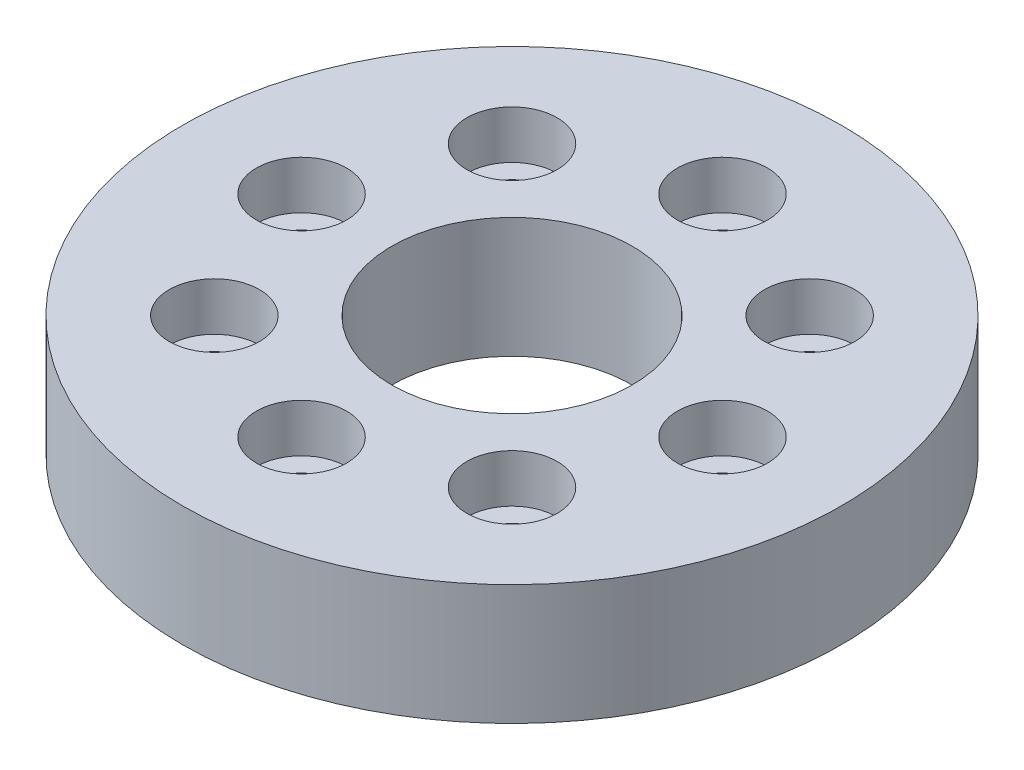
ISO-10303-21;
HEADER;
FILE_DESCRIPTION(('STEP AP214'),'2;1');
FILE_NAME('part.step','',(''),(''),'','','');
FILE_SCHEMA(('AUTOMOTIVE_DESIGN { 1 0 10303 214 1 1 1 1 }'));
ENDSEC;
DATA;
#1=APPLICATION_CONTEXT('core data for automotive mechanical design processes');
#2=APPLICATION_PROTOCOL_DEFINITION('international standard','automotive_design',2000,#1);
#3=PRODUCT_CONTEXT('',#1,'mechanical');
#4=PRODUCT('Part','Part','',(#3));
#5=PRODUCT_RELATED_PRODUCT_CATEGORY('part','',(#4));
#6=PRODUCT_DEFINITION_FORMATION('','',#4);
#7=PRODUCT_DEFINITION_CONTEXT('part definition',#1,'design');
#8=PRODUCT_DEFINITION('design','',#6,#7);
#9=PRODUCT_DEFINITION_SHAPE('','',#8);
#10=(LENGTH_UNIT() NAMED_UNIT(*) SI_UNIT(.MILLI.,.METRE.));
#11=(NAMED_UNIT(*) PLANE_ANGLE_UNIT() SI_UNIT($,.RADIAN.));
#12=(NAMED_UNIT(*) SI_UNIT($,.STERADIAN.) SOLID_ANGLE_UNIT());
#13=UNCERTAINTY_MEASURE_WITH_UNIT(LENGTH_MEASURE(1.E-05),#10,'distance_accuracy_value','');
#14=(GEOMETRIC_REPRESENTATION_CONTEXT(3) GLOBAL_UNCERTAINTY_ASSIGNED_CONTEXT((#13)) GLOBAL_UNIT_ASSIGNED_CONTEXT((#10,
#11,#12)) REPRESENTATION_CONTEXT('',''));
#15=CARTESIAN_POINT('',(0.,0.,0.));
#16=DIRECTION('',(0.,0.,1.));
#17=DIRECTION('',(1.,0.,0.));
#18=AXIS2_PLACEMENT_3D('',#15,#16,#17);
#19=CARTESIAN_POINT('',(12.3743686707646,10.,-12.3743686707646));
#20=DIRECTION('',(0.,-1.,0.));
#21=DIRECTION('',(0.,0.,-1.));
#22=AXIS2_PLACEMENT_3D('',#19,#20,#21);
#23=CYLINDRICAL_SURFACE('',#22,2.);
#24=CARTESIAN_POINT('',(12.3743686707646,0.,-12.3743686707646));
#25=DIRECTION('',(0.,1.,0.));
#26=DIRECTION('',(0.,0.,1.));
#27=AXIS2_PLACEMENT_3D('',#24,#25,#26);
#28=CIRCLE('',#27,2.);
#29=CARTESIAN_POINT('',(12.3743686707646,0.,-10.3743686707646));
#30=VERTEX_POINT('',#29);
#31=EDGE_CURVE('E80',#30,#30,#28,.T.);
#32=ORIENTED_EDGE('',*,*,#31,.F.);
#33=EDGE_LOOP('',(#32));
#34=FACE_BOUND('',#33,.T.);
#35=CARTESIAN_POINT('',(12.3743686707646,6.,-12.3743686707646));
#36=DIRECTION('',(0.,1.,0.));
#37=DIRECTION('',(0.,0.,1.));
#38=AXIS2_PLACEMENT_3D('',#35,#36,#37);
#39=CIRCLE('',#38,2.);
#40=CARTESIAN_POINT('',(12.3743686707646,6.,-10.3743686707646));
#41=VERTEX_POINT('',#40);
#42=EDGE_CURVE('E43',#41,#41,#39,.T.);
#43=ORIENTED_EDGE('',*,*,#42,.T.);
#44=EDGE_LOOP('',(#43));
#45=FACE_BOUND('',#44,.T.);
#46=ADVANCED_FACE('F39',(#34,#45),#23,.F.);
#47=CARTESIAN_POINT('',(17.5,10.,0.));
#48=DIRECTION('',(0.,-1.,0.));
#49=DIRECTION('',(0.,0.,-1.));
#50=AXIS2_PLACEMENT_3D('',#47,#48,#49);
#51=CYLINDRICAL_SURFACE('',#50,2.);
#52=CARTESIAN_POINT('',(17.5,0.,0.));
#53=DIRECTION('',(0.,1.,0.));
#54=DIRECTION('',(0.,0.,1.));
#55=AXIS2_PLACEMENT_3D('',#52,#53,#54);
#56=CIRCLE('',#55,2.);
#57=CARTESIAN_POINT('',(17.5,0.,2.00000000000006));
#58=VERTEX_POINT('',#57);
#59=EDGE_CURVE('E77',#58,#58,#56,.T.);
#60=ORIENTED_EDGE('',*,*,#59,.F.);
#61=EDGE_LOOP('',(#60));
#62=FACE_BOUND('',#61,.T.);
#63=CARTESIAN_POINT('',(17.5,6.,0.));
#64=DIRECTION('',(0.,1.,0.));
#65=DIRECTION('',(0.,0.,1.));
#66=AXIS2_PLACEMENT_3D('',#63,#64,#65);
#67=CIRCLE('',#66,2.);
#68=CARTESIAN_POINT('',(17.5,6.,2.00000000000006));
#69=VERTEX_POINT('',#68);
#70=EDGE_CURVE('E103',#69,#69,#67,.T.);
#71=ORIENTED_EDGE('',*,*,#70,.T.);
#72=EDGE_LOOP('',(#71));
#73=FACE_BOUND('',#72,.T.);
#74=ADVANCED_FACE('F221',(#62,#73),#51,.F.);
#75=CARTESIAN_POINT('',(12.3743686707645,10.,12.3743686707646));
#76=DIRECTION('',(0.,-1.,0.));
#77=DIRECTION('',(0.,0.,-1.));
#78=AXIS2_PLACEMENT_3D('',#75,#76,#77);
#79=CYLINDRICAL_SURFACE('',#78,2.);
#80=CARTESIAN_POINT('',(12.3743686707645,0.,12.3743686707646));
#81=DIRECTION('',(0.,1.,0.));
#82=DIRECTION('',(0.,0.,1.));
#83=AXIS2_PLACEMENT_3D('',#80,#81,#82);
#84=CIRCLE('',#83,2.);
#85=CARTESIAN_POINT('',(12.3743686707645,0.,14.3743686707646));
#86=VERTEX_POINT('',#85);
#87=EDGE_CURVE('E74',#86,#86,#84,.T.);
#88=ORIENTED_EDGE('',*,*,#87,.F.);
#89=EDGE_LOOP('',(#88));
#90=FACE_BOUND('',#89,.T.);
#91=CARTESIAN_POINT('',(12.3743686707645,6.,12.3743686707646));
#92=DIRECTION('',(0.,1.,0.));
#93=DIRECTION('',(0.,0.,1.));
#94=AXIS2_PLACEMENT_3D('',#91,#92,#93);
#95=CIRCLE('',#94,2.);
#96=CARTESIAN_POINT('',(12.3743686707645,6.,14.3743686707646));
#97=VERTEX_POINT('',#96);
#98=EDGE_CURVE('E101',#97,#97,#95,.T.);
#99=ORIENTED_EDGE('',*,*,#98,.T.);
#100=EDGE_LOOP('',(#99));
#101=FACE_BOUND('',#100,.T.);
#102=ADVANCED_FACE('F226',(#90,#101),#79,.F.);
#103=CARTESIAN_POINT('',(-1.2220184685951E-13,10.,17.5));
#104=DIRECTION('',(0.,-1.,0.));
#105=DIRECTION('',(0.,0.,-1.));
#106=AXIS2_PLACEMENT_3D('',#103,#104,#105);
#107=CYLINDRICAL_SURFACE('',#106,2.);
#108=CARTESIAN_POINT('',(-1.2220184685951E-13,0.,17.5));
#109=DIRECTION('',(0.,1.,0.));
#110=DIRECTION('',(0.,0.,1.));
#111=AXIS2_PLACEMENT_3D('',#108,#109,#110);
#112=CIRCLE('',#111,2.);
#113=CARTESIAN_POINT('',(-1.2220184685951E-13,0.,19.5));
#114=VERTEX_POINT('',#113);
#115=EDGE_CURVE('E71',#114,#114,#112,.T.);
#116=ORIENTED_EDGE('',*,*,#115,.F.);
#117=EDGE_LOOP('',(#116));
#118=FACE_BOUND('',#117,.T.);
#119=CARTESIAN_POINT('',(-1.2220184685951E-13,6.,17.5));
#120=DIRECTION('',(0.,1.,0.));
#121=DIRECTION('',(0.,0.,1.));
#122=AXIS2_PLACEMENT_3D('',#119,#120,#121);
#123=CIRCLE('',#122,2.);
#124=CARTESIAN_POINT('',(-1.2220184685951E-13,6.,19.5));
#125=VERTEX_POINT('',#124);
#126=EDGE_CURVE('E98',#125,#125,#123,.T.);
#127=ORIENTED_EDGE('',*,*,#126,.T.);
#128=EDGE_LOOP('',(#127));
#129=FACE_BOUND('',#128,.T.);
#130=ADVANCED_FACE('F232',(#118,#129),#107,.F.);
#131=CARTESIAN_POINT('',(-12.3743686707647,10.,12.3743686707645));
#132=DIRECTION('',(0.,-1.,0.));
#133=DIRECTION('',(0.,0.,-1.));
#134=AXIS2_PLACEMENT_3D('',#131,#132,#133);
#135=CYLINDRICAL_SURFACE('',#134,2.);
#136=CARTESIAN_POINT('',(-12.3743686707647,0.,12.3743686707645));
#137=DIRECTION('',(0.,1.,0.));
#138=DIRECTION('',(0.,0.,1.));
#139=AXIS2_PLACEMENT_3D('',#136,#137,#138);
#140=CIRCLE('',#139,2.);
#141=CARTESIAN_POINT('',(-12.3743686707647,0.,14.3743686707645));
#142=VERTEX_POINT('',#141);
#143=EDGE_CURVE('E68',#142,#142,#140,.T.);
#144=ORIENTED_EDGE('',*,*,#143,.F.);
#145=EDGE_LOOP('',(#144));
#146=FACE_BOUND('',#145,.T.);
#147=CARTESIAN_POINT('',(-12.3743686707647,6.,12.3743686707645));
#148=DIRECTION('',(0.,1.,0.));
#149=DIRECTION('',(0.,0.,1.));
#150=AXIS2_PLACEMENT_3D('',#147,#148,#149);
#151=CIRCLE('',#150,2.);
#152=CARTESIAN_POINT('',(-12.3743686707647,6.,14.3743686707645));
#153=VERTEX_POINT('',#152);
#154=EDGE_CURVE('E95',#153,#153,#151,.T.);
#155=ORIENTED_EDGE('',*,*,#154,.T.);
#156=EDGE_LOOP('',(#155));
#157=FACE_BOUND('',#156,.T.);
#158=ADVANCED_FACE('F236',(#146,#157),#135,.F.);
#159=CARTESIAN_POINT('',(-17.5,10.,-1.83302770289265E-13));
#160=DIRECTION('',(0.,-1.,0.));
#161=DIRECTION('',(0.,0.,-1.));
#162=AXIS2_PLACEMENT_3D('',#159,#160,#161);
#163=CYLINDRICAL_SURFACE('',#162,2.);
#164=CARTESIAN_POINT('',(-17.5,0.,-1.83302770289265E-13));
#165=DIRECTION('',(0.,1.,0.));
#166=DIRECTION('',(0.,0.,1.));
#167=AXIS2_PLACEMENT_3D('',#164,#165,#166);
#168=CIRCLE('',#167,2.);
#169=CARTESIAN_POINT('',(-17.5,0.,1.99999999999982));
#170=VERTEX_POINT('',#169);
#171=EDGE_CURVE('E65',#170,#170,#168,.T.);
#172=ORIENTED_EDGE('',*,*,#171,.F.);
#173=EDGE_LOOP('',(#172));
#174=FACE_BOUND('',#173,.T.);
#175=CARTESIAN_POINT('',(-17.5,6.,-1.83302770289265E-13));
#176=DIRECTION('',(0.,1.,0.));
#177=DIRECTION('',(0.,0.,1.));
#178=AXIS2_PLACEMENT_3D('',#175,#176,#177);
#179=CIRCLE('',#178,2.);
#180=CARTESIAN_POINT('',(-17.5,6.,1.99999999999982));
#181=VERTEX_POINT('',#180);
#182=EDGE_CURVE('E92',#181,#181,#179,.T.);
#183=ORIENTED_EDGE('',*,*,#182,.T.);
#184=EDGE_LOOP('',(#183));
#185=FACE_BOUND('',#184,.T.);
#186=ADVANCED_FACE('F240',(#174,#185),#163,.F.);
#187=CARTESIAN_POINT('',(-12.3743686707644,10.,-12.3743686707647));
#188=DIRECTION('',(0.,-1.,0.));
#189=DIRECTION('',(0.,0.,-1.));
#190=AXIS2_PLACEMENT_3D('',#187,#188,#189);
#191=CYLINDRICAL_SURFACE('',#190,2.);
#192=CARTESIAN_POINT('',(-12.3743686707644,0.,-12.3743686707647));
#193=DIRECTION('',(0.,1.,0.));
#194=DIRECTION('',(0.,0.,1.));
#195=AXIS2_PLACEMENT_3D('',#192,#193,#194);
#196=CIRCLE('',#195,2.);
#197=CARTESIAN_POINT('',(-12.3743686707644,0.,-10.3743686707647));
#198=VERTEX_POINT('',#197);
#199=EDGE_CURVE('E62',#198,#198,#196,.T.);
#200=ORIENTED_EDGE('',*,*,#199,.F.);
#201=EDGE_LOOP('',(#200));
#202=FACE_BOUND('',#201,.T.);
#203=CARTESIAN_POINT('',(-12.3743686707644,6.,-12.3743686707647));
#204=DIRECTION('',(0.,1.,0.));
#205=DIRECTION('',(0.,0.,1.));
#206=AXIS2_PLACEMENT_3D('',#203,#204,#205);
#207=CIRCLE('',#206,2.);
#208=CARTESIAN_POINT('',(-12.3743686707644,6.,-10.3743686707647));
#209=VERTEX_POINT('',#208);
#210=EDGE_CURVE('E88',#209,#209,#207,.T.);
#211=ORIENTED_EDGE('',*,*,#210,.T.);
#212=EDGE_LOOP('',(#211));
#213=FACE_BOUND('',#212,.T.);
#214=ADVANCED_FACE('F244',(#202,#213),#191,.F.);
#215=CARTESIAN_POINT('',(0.,10.,-17.5));
#216=DIRECTION('',(0.,-1.,0.));
#217=DIRECTION('',(0.,0.,-1.));
#218=AXIS2_PLACEMENT_3D('',#215,#216,#217);
#219=CYLINDRICAL_SURFACE('',#218,2.);
#220=CARTESIAN_POINT('',(0.,0.,-17.5));
#221=DIRECTION('',(0.,1.,0.));
#222=DIRECTION('',(0.,0.,1.));
#223=AXIS2_PLACEMENT_3D('',#220,#221,#222);
#224=CIRCLE('',#223,2.);
#225=CARTESIAN_POINT('',(0.,0.,-15.5));
#226=VERTEX_POINT('',#225);
#227=EDGE_CURVE('E59',#226,#226,#224,.T.);
#228=ORIENTED_EDGE('',*,*,#227,.F.);
#229=EDGE_LOOP('',(#228));
#230=FACE_BOUND('',#229,.T.);
#231=CARTESIAN_POINT('',(0.,6.,-17.5));
#232=DIRECTION('',(0.,1.,0.));
#233=DIRECTION('',(0.,0.,1.));
#234=AXIS2_PLACEMENT_3D('',#231,#232,#233);
#235=CIRCLE('',#234,2.);
#236=CARTESIAN_POINT('',(0.,6.,-15.5));
#237=VERTEX_POINT('',#236);
#238=EDGE_CURVE('E85',#237,#237,#235,.T.);
#239=ORIENTED_EDGE('',*,*,#238,.T.);
#240=EDGE_LOOP('',(#239));
#241=FACE_BOUND('',#240,.T.);
#242=ADVANCED_FACE('F190',(#230,#241),#219,.F.);
#243=CARTESIAN_POINT('',(0.,10.,0.));
#244=DIRECTION('',(0.,-1.,0.));
#245=DIRECTION('',(0.,0.,-1.));
#246=AXIS2_PLACEMENT_3D('',#243,#244,#245);
#247=CYLINDRICAL_SURFACE('',#246,27.4);
#248=CARTESIAN_POINT('',(0.,10.,0.));
#249=DIRECTION('',(0.,1.,0.));
#250=DIRECTION('',(0.,0.,1.));
#251=AXIS2_PLACEMENT_3D('',#248,#249,#250);
#252=CIRCLE('',#251,27.4);
#253=CARTESIAN_POINT('',(0.,10.,27.4));
#254=VERTEX_POINT('',#253);
#255=EDGE_CURVE('E47',#254,#254,#252,.T.);
#256=ORIENTED_EDGE('',*,*,#255,.F.);
#257=EDGE_LOOP('',(#256));
#258=FACE_BOUND('',#257,.T.);
#259=CARTESIAN_POINT('',(0.,0.,0.));
#260=DIRECTION('',(0.,1.,0.));
#261=DIRECTION('',(0.,0.,1.));
#262=AXIS2_PLACEMENT_3D('',#259,#260,#261);
#263=CIRCLE('',#262,27.4);
#264=CARTESIAN_POINT('',(0.,0.,27.4));
#265=VERTEX_POINT('',#264);
#266=EDGE_CURVE('E56',#265,#265,#263,.T.);
#267=ORIENTED_EDGE('',*,*,#266,.T.);
#268=EDGE_LOOP('',(#267));
#269=FACE_BOUND('',#268,.T.);
#270=ADVANCED_FACE('F41',(#258,#269),#247,.T.);
#271=CARTESIAN_POINT('',(0.,10.,0.));
#272=DIRECTION('',(0.,-1.,0.));
#273=DIRECTION('',(0.,0.,-1.));
#274=AXIS2_PLACEMENT_3D('',#271,#272,#273);
#275=CYLINDRICAL_SURFACE('',#274,10.);
#276=CARTESIAN_POINT('',(0.,10.,0.));
#277=DIRECTION('',(0.,1.,0.));
#278=DIRECTION('',(0.,0.,1.));
#279=AXIS2_PLACEMENT_3D('',#276,#277,#278);
#280=CIRCLE('',#279,10.);
#281=CARTESIAN_POINT('',(0.,10.,10.));
#282=VERTEX_POINT('',#281);
#283=EDGE_CURVE('E10',#282,#282,#280,.T.);
#284=ORIENTED_EDGE('',*,*,#283,.T.);
#285=EDGE_LOOP('',(#284));
#286=FACE_BOUND('',#285,.T.);
#287=CARTESIAN_POINT('',(0.,0.,0.));
#288=DIRECTION('',(0.,1.,0.));
#289=DIRECTION('',(0.,0.,1.));
#290=AXIS2_PLACEMENT_3D('',#287,#288,#289);
#291=CIRCLE('',#290,10.);
#292=CARTESIAN_POINT('',(0.,0.,10.));
#293=VERTEX_POINT('',#292);
#294=EDGE_CURVE('E52',#293,#293,#291,.T.);
#295=ORIENTED_EDGE('',*,*,#294,.F.);
#296=EDGE_LOOP('',(#295));
#297=FACE_BOUND('',#296,.T.);
#298=ADVANCED_FACE('F177',(#286,#297),#275,.F.);
#299=CARTESIAN_POINT('',(0.,10.,0.));
#300=DIRECTION('',(0.,1.,0.));
#301=DIRECTION('',(0.,0.,1.));
#302=AXIS2_PLACEMENT_3D('',#299,#300,#301);
#303=PLANE('',#302);
#304=CARTESIAN_POINT('',(2.4459601011273E-13,10.,-17.5));
#305=DIRECTION('',(0.,1.,0.));
#306=DIRECTION('',(0.,0.,1.));
#307=AXIS2_PLACEMENT_3D('',#304,#305,#306);
#308=CIRCLE('',#307,3.75);
#309=CARTESIAN_POINT('',(2.4459601011273E-13,10.,-13.75));
#310=VERTEX_POINT('',#309);
#311=EDGE_CURVE('E144',#310,#310,#308,.T.);
#312=ORIENTED_EDGE('',*,*,#311,.F.);
#313=EDGE_LOOP('',(#312));
#314=FACE_BOUND('',#313,.T.);
#315=CARTESIAN_POINT('',(12.3743686707648,10.,-12.3743686707644));
#316=DIRECTION('',(0.,1.,0.));
#317=DIRECTION('',(0.,0.,1.));
#318=AXIS2_PLACEMENT_3D('',#315,#316,#317);
#319=CIRCLE('',#318,3.75);
#320=CARTESIAN_POINT('',(12.3743686707648,10.,-8.62436867076439));
#321=VERTEX_POINT('',#320);
#322=EDGE_CURVE('E121',#321,#321,#319,.T.);
#323=ORIENTED_EDGE('',*,*,#322,.F.);
#324=EDGE_LOOP('',(#323));
#325=FACE_BOUND('',#324,.T.);
#326=CARTESIAN_POINT('',(17.5,10.,3.08780778723872E-13));
#327=DIRECTION('',(0.,1.,0.));
#328=DIRECTION('',(0.,0.,1.));
#329=AXIS2_PLACEMENT_3D('',#326,#327,#328);
#330=CIRCLE('',#329,3.75);
#331=CARTESIAN_POINT('',(17.5,10.,3.75000000000031));
#332=VERTEX_POINT('',#331);
#333=EDGE_CURVE('E122',#332,#332,#330,.T.);
#334=ORIENTED_EDGE('',*,*,#333,.F.);
#335=EDGE_LOOP('',(#334));
#336=FACE_BOUND('',#335,.T.);
#337=CARTESIAN_POINT('',(12.3743686707643,10.,12.3743686707648));
#338=DIRECTION('',(0.,1.,0.));
#339=DIRECTION('',(0.,0.,1.));
#340=AXIS2_PLACEMENT_3D('',#337,#338,#339);
#341=CIRCLE('',#340,3.75);
#342=CARTESIAN_POINT('',(12.3743686707643,10.,16.1243686707648));
#343=VERTEX_POINT('',#342);
#344=EDGE_CURVE('E134',#343,#343,#341,.T.);
#345=ORIENTED_EDGE('',*,*,#344,.F.);
#346=EDGE_LOOP('',(#345));
#347=FACE_BOUND('',#346,.T.);
#348=CARTESIAN_POINT('',(-3.64291929955129E-13,10.,17.5));
#349=DIRECTION('',(0.,1.,0.));
#350=DIRECTION('',(0.,0.,1.));
#351=AXIS2_PLACEMENT_3D('',#348,#349,#350);
#352=CIRCLE('',#351,3.75);
#353=CARTESIAN_POINT('',(-3.64291929955129E-13,10.,21.25));
#354=VERTEX_POINT('',#353);
#355=EDGE_CURVE('E140',#354,#354,#352,.T.);
#356=ORIENTED_EDGE('',*,*,#355,.F.);
#357=EDGE_LOOP('',(#356));
#358=FACE_BOUND('',#357,.T.);
#359=CARTESIAN_POINT('',(-12.3743686707649,10.,12.3743686707643));
#360=DIRECTION('',(0.,1.,0.));
#361=DIRECTION('',(0.,0.,1.));
#362=AXIS2_PLACEMENT_3D('',#359,#360,#361);
#363=CIRCLE('',#362,3.75);
#364=CARTESIAN_POINT('',(-12.3743686707649,10.,16.1243686707643));
#365=VERTEX_POINT('',#364);
#366=EDGE_CURVE('E162',#365,#365,#363,.T.);
#367=ORIENTED_EDGE('',*,*,#366,.F.);
#368=EDGE_LOOP('',(#367));
#369=FACE_BOUND('',#368,.T.);
#370=CARTESIAN_POINT('',(-17.5,10.,-4.26741975090295E-13));
#371=DIRECTION('',(0.,1.,0.));
#372=DIRECTION('',(0.,0.,1.));
#373=AXIS2_PLACEMENT_3D('',#370,#371,#372);
#374=CIRCLE('',#373,3.75);
#375=CARTESIAN_POINT('',(-17.5,10.,3.74999999999957));
#376=VERTEX_POINT('',#375);
#377=EDGE_CURVE('E156',#376,#376,#374,.T.);
#378=ORIENTED_EDGE('',*,*,#377,.F.);
#379=EDGE_LOOP('',(#378));
#380=FACE_BOUND('',#379,.T.);
#381=CARTESIAN_POINT('',(-12.3743686707644,10.,-12.3743686707647));
#382=DIRECTION('',(0.,1.,0.));
#383=DIRECTION('',(0.,0.,1.));
#384=AXIS2_PLACEMENT_3D('',#381,#382,#383);
#385=CIRCLE('',#384,3.75);
#386=CARTESIAN_POINT('',(-12.3743686707644,10.,-8.62436867076473));
#387=VERTEX_POINT('',#386);
#388=EDGE_CURVE('E142',#387,#387,#385,.T.);
#389=ORIENTED_EDGE('',*,*,#388,.F.);
#390=EDGE_LOOP('',(#389));
#391=FACE_BOUND('',#390,.T.);
#392=ORIENTED_EDGE('',*,*,#255,.T.);
#393=EDGE_LOOP('',(#392));
#394=FACE_BOUND('',#393,.T.);
#395=ORIENTED_EDGE('',*,*,#283,.F.);
#396=EDGE_LOOP('',(#395));
#397=FACE_BOUND('',#396,.T.);
#398=ADVANCED_FACE('F173',(#314,#325,#336,#347,#358,#369,#380,#391,#394,#397),#303,.T.);
#399=CARTESIAN_POINT('',(0.,0.,0.));
#400=DIRECTION('',(0.,1.,0.));
#401=DIRECTION('',(0.,0.,1.));
#402=AXIS2_PLACEMENT_3D('',#399,#400,#401);
#403=PLANE('',#402);
#404=ORIENTED_EDGE('',*,*,#266,.F.);
#405=EDGE_LOOP('',(#404));
#406=FACE_BOUND('',#405,.T.);
#407=ORIENTED_EDGE('',*,*,#227,.T.);
#408=EDGE_LOOP('',(#407));
#409=FACE_BOUND('',#408,.T.);
#410=ORIENTED_EDGE('',*,*,#199,.T.);
#411=EDGE_LOOP('',(#410));
#412=FACE_BOUND('',#411,.T.);
#413=ORIENTED_EDGE('',*,*,#171,.T.);
#414=EDGE_LOOP('',(#413));
#415=FACE_BOUND('',#414,.T.);
#416=ORIENTED_EDGE('',*,*,#143,.T.);
#417=EDGE_LOOP('',(#416));
#418=FACE_BOUND('',#417,.T.);
#419=ORIENTED_EDGE('',*,*,#115,.T.);
#420=EDGE_LOOP('',(#419));
#421=FACE_BOUND('',#420,.T.);
#422=ORIENTED_EDGE('',*,*,#87,.T.);
#423=EDGE_LOOP('',(#422));
#424=FACE_BOUND('',#423,.T.);
#425=ORIENTED_EDGE('',*,*,#59,.T.);
#426=EDGE_LOOP('',(#425));
#427=FACE_BOUND('',#426,.T.);
#428=ORIENTED_EDGE('',*,*,#31,.T.);
#429=EDGE_LOOP('',(#428));
#430=FACE_BOUND('',#429,.T.);
#431=ORIENTED_EDGE('',*,*,#294,.T.);
#432=EDGE_LOOP('',(#431));
#433=FACE_BOUND('',#432,.T.);
#434=ADVANCED_FACE('F176',(#406,#409,#412,#415,#418,#421,#424,#427,#430,#433),#403,.F.);
#435=CARTESIAN_POINT('',(-12.3743686707644,6.,-12.3743686707647));
#436=DIRECTION('',(0.,1.,0.));
#437=DIRECTION('',(0.,0.,1.));
#438=AXIS2_PLACEMENT_3D('',#435,#436,#437);
#439=CYLINDRICAL_SURFACE('',#438,3.75);
#440=CARTESIAN_POINT('',(-12.3743686707644,6.,-12.3743686707647));
#441=DIRECTION('',(0.,1.,0.));
#442=DIRECTION('',(0.,0.,1.));
#443=AXIS2_PLACEMENT_3D('',#440,#441,#442);
#444=CIRCLE('',#443,3.75);
#445=CARTESIAN_POINT('',(-12.3743686707644,6.,-8.62436867076473));
#446=VERTEX_POINT('',#445);
#447=EDGE_CURVE('E89',#446,#446,#444,.T.);
#448=ORIENTED_EDGE('',*,*,#447,.F.);
#449=EDGE_LOOP('',(#448));
#450=FACE_BOUND('',#449,.T.);
#451=ORIENTED_EDGE('',*,*,#388,.T.);
#452=EDGE_LOOP('',(#451));
#453=FACE_BOUND('',#452,.T.);
#454=ADVANCED_FACE('F195',(#450,#453),#439,.F.);
#455=CARTESIAN_POINT('',(-12.3743686707644,6.,-12.3743686707647));
#456=DIRECTION('',(0.,1.,0.));
#457=DIRECTION('',(0.,0.,1.));
#458=AXIS2_PLACEMENT_3D('',#455,#456,#457);
#459=PLANE('',#458);
#460=ORIENTED_EDGE('',*,*,#210,.F.);
#461=EDGE_LOOP('',(#460));
#462=FACE_BOUND('',#461,.T.);
#463=ORIENTED_EDGE('',*,*,#447,.T.);
#464=EDGE_LOOP('',(#463));
#465=FACE_BOUND('',#464,.T.);
#466=ADVANCED_FACE('F288',(#462,#465),#459,.T.);
#467=CARTESIAN_POINT('',(-17.5,6.,-4.26741975090295E-13));
#468=DIRECTION('',(0.,1.,0.));
#469=DIRECTION('',(0.,0.,1.));
#470=AXIS2_PLACEMENT_3D('',#467,#468,#469);
#471=CYLINDRICAL_SURFACE('',#470,3.75);
#472=CARTESIAN_POINT('',(-17.5,6.,-4.26741975090295E-13));
#473=DIRECTION('',(0.,1.,0.));
#474=DIRECTION('',(0.,0.,1.));
#475=AXIS2_PLACEMENT_3D('',#472,#473,#474);
#476=CIRCLE('',#475,3.75);
#477=CARTESIAN_POINT('',(-17.5,6.,3.74999999999957));
#478=VERTEX_POINT('',#477);
#479=EDGE_CURVE('E153',#478,#478,#476,.T.);
#480=ORIENTED_EDGE('',*,*,#479,.F.);
#481=EDGE_LOOP('',(#480));
#482=FACE_BOUND('',#481,.T.);
#483=ORIENTED_EDGE('',*,*,#377,.T.);
#484=EDGE_LOOP('',(#483));
#485=FACE_BOUND('',#484,.T.);
#486=ADVANCED_FACE('F291',(#482,#485),#471,.F.);
#487=CARTESIAN_POINT('',(-17.5,6.,-4.26741975090295E-13));
#488=DIRECTION('',(0.,1.,0.));
#489=DIRECTION('',(0.,0.,1.));
#490=AXIS2_PLACEMENT_3D('',#487,#488,#489);
#491=PLANE('',#490);
#492=ORIENTED_EDGE('',*,*,#182,.F.);
#493=EDGE_LOOP('',(#492));
#494=FACE_BOUND('',#493,.T.);
#495=ORIENTED_EDGE('',*,*,#479,.T.);
#496=EDGE_LOOP('',(#495));
#497=FACE_BOUND('',#496,.T.);
#498=ADVANCED_FACE('F266',(#494,#497),#491,.T.);
#499=CARTESIAN_POINT('',(-12.3743686707649,6.,12.3743686707643));
#500=DIRECTION('',(0.,1.,0.));
#501=DIRECTION('',(0.,0.,1.));
#502=AXIS2_PLACEMENT_3D('',#499,#500,#501);
#503=CYLINDRICAL_SURFACE('',#502,3.75);
#504=CARTESIAN_POINT('',(-12.3743686707649,6.,12.3743686707643));
#505=DIRECTION('',(0.,1.,0.));
#506=DIRECTION('',(0.,0.,1.));
#507=AXIS2_PLACEMENT_3D('',#504,#505,#506);
#508=CIRCLE('',#507,3.75);
#509=CARTESIAN_POINT('',(-12.3743686707649,6.,16.1243686707643));
#510=VERTEX_POINT('',#509);
#511=EDGE_CURVE('E159',#510,#510,#508,.T.);
#512=ORIENTED_EDGE('',*,*,#511,.F.);
#513=EDGE_LOOP('',(#512));
#514=FACE_BOUND('',#513,.T.);
#515=ORIENTED_EDGE('',*,*,#366,.T.);
#516=EDGE_LOOP('',(#515));
#517=FACE_BOUND('',#516,.T.);
#518=ADVANCED_FACE('F321',(#514,#517),#503,.F.);
#519=CARTESIAN_POINT('',(-12.3743686707649,6.,12.3743686707643));
#520=DIRECTION('',(0.,1.,0.));
#521=DIRECTION('',(0.,0.,1.));
#522=AXIS2_PLACEMENT_3D('',#519,#520,#521);
#523=PLANE('',#522);
#524=ORIENTED_EDGE('',*,*,#154,.F.);
#525=EDGE_LOOP('',(#524));
#526=FACE_BOUND('',#525,.T.);
#527=ORIENTED_EDGE('',*,*,#511,.T.);
#528=EDGE_LOOP('',(#527));
#529=FACE_BOUND('',#528,.T.);
#530=ADVANCED_FACE('F329',(#526,#529),#523,.T.);
#531=CARTESIAN_POINT('',(-3.64291929955129E-13,6.,17.5));
#532=DIRECTION('',(0.,1.,0.));
#533=DIRECTION('',(0.,0.,1.));
#534=AXIS2_PLACEMENT_3D('',#531,#532,#533);
#535=CYLINDRICAL_SURFACE('',#534,3.75);
#536=CARTESIAN_POINT('',(-3.64291929955129E-13,6.,17.5));
#537=DIRECTION('',(0.,1.,0.));
#538=DIRECTION('',(0.,0.,1.));
#539=AXIS2_PLACEMENT_3D('',#536,#537,#538);
#540=CIRCLE('',#539,3.75);
#541=CARTESIAN_POINT('',(-3.64291929955129E-13,6.,21.25));
#542=VERTEX_POINT('',#541);
#543=EDGE_CURVE('E165',#542,#542,#540,.T.);
#544=ORIENTED_EDGE('',*,*,#543,.F.);
#545=EDGE_LOOP('',(#544));
#546=FACE_BOUND('',#545,.T.);
#547=ORIENTED_EDGE('',*,*,#355,.T.);
#548=EDGE_LOOP('',(#547));
#549=FACE_BOUND('',#548,.T.);
#550=ADVANCED_FACE('F171',(#546,#549),#535,.F.);
#551=CARTESIAN_POINT('',(-3.64291929955129E-13,6.,17.5));
#552=DIRECTION('',(0.,1.,0.));
#553=DIRECTION('',(0.,0.,1.));
#554=AXIS2_PLACEMENT_3D('',#551,#552,#553);
#555=PLANE('',#554);
#556=ORIENTED_EDGE('',*,*,#126,.F.);
#557=EDGE_LOOP('',(#556));
#558=FACE_BOUND('',#557,.T.);
#559=ORIENTED_EDGE('',*,*,#543,.T.);
#560=EDGE_LOOP('',(#559));
#561=FACE_BOUND('',#560,.T.);
#562=ADVANCED_FACE('F283',(#558,#561),#555,.T.);
#563=CARTESIAN_POINT('',(12.3743686707643,6.,12.3743686707648));
#564=DIRECTION('',(0.,1.,0.));
#565=DIRECTION('',(0.,0.,1.));
#566=AXIS2_PLACEMENT_3D('',#563,#564,#565);
#567=CYLINDRICAL_SURFACE('',#566,3.75);
#568=CARTESIAN_POINT('',(12.3743686707643,6.,12.3743686707648));
#569=DIRECTION('',(0.,1.,0.));
#570=DIRECTION('',(0.,0.,1.));
#571=AXIS2_PLACEMENT_3D('',#568,#569,#570);
#572=CIRCLE('',#571,3.75);
#573=CARTESIAN_POINT('',(12.3743686707643,6.,16.1243686707648));
#574=VERTEX_POINT('',#573);
#575=EDGE_CURVE('E137',#574,#574,#572,.T.);
#576=ORIENTED_EDGE('',*,*,#575,.F.);
#577=EDGE_LOOP('',(#576));
#578=FACE_BOUND('',#577,.T.);
#579=ORIENTED_EDGE('',*,*,#344,.T.);
#580=EDGE_LOOP('',(#579));
#581=FACE_BOUND('',#580,.T.);
#582=ADVANCED_FACE('F280',(#578,#581),#567,.F.);
#583=CARTESIAN_POINT('',(12.3743686707643,6.,12.3743686707648));
#584=DIRECTION('',(0.,1.,0.));
#585=DIRECTION('',(0.,0.,1.));
#586=AXIS2_PLACEMENT_3D('',#583,#584,#585);
#587=PLANE('',#586);
#588=ORIENTED_EDGE('',*,*,#98,.F.);
#589=EDGE_LOOP('',(#588));
#590=FACE_BOUND('',#589,.T.);
#591=ORIENTED_EDGE('',*,*,#575,.T.);
#592=EDGE_LOOP('',(#591));
#593=FACE_BOUND('',#592,.T.);
#594=ADVANCED_FACE('F275',(#590,#593),#587,.T.);
#595=CARTESIAN_POINT('',(17.5,6.,3.08780778723872E-13));
#596=DIRECTION('',(0.,1.,0.));
#597=DIRECTION('',(0.,0.,1.));
#598=AXIS2_PLACEMENT_3D('',#595,#596,#597);
#599=CYLINDRICAL_SURFACE('',#598,3.75);
#600=CARTESIAN_POINT('',(17.5,6.,3.08780778723872E-13));
#601=DIRECTION('',(0.,1.,0.));
#602=DIRECTION('',(0.,0.,1.));
#603=AXIS2_PLACEMENT_3D('',#600,#601,#602);
#604=CIRCLE('',#603,3.75);
#605=CARTESIAN_POINT('',(17.5,6.,3.75000000000031));
#606=VERTEX_POINT('',#605);
#607=EDGE_CURVE('E128',#606,#606,#604,.T.);
#608=ORIENTED_EDGE('',*,*,#607,.F.);
#609=EDGE_LOOP('',(#608));
#610=FACE_BOUND('',#609,.T.);
#611=ORIENTED_EDGE('',*,*,#333,.T.);
#612=EDGE_LOOP('',(#611));
#613=FACE_BOUND('',#612,.T.);
#614=ADVANCED_FACE('F272',(#610,#613),#599,.F.);
#615=CARTESIAN_POINT('',(17.5,6.,3.08780778723872E-13));
#616=DIRECTION('',(0.,1.,0.));
#617=DIRECTION('',(0.,0.,1.));
#618=AXIS2_PLACEMENT_3D('',#615,#616,#617);
#619=PLANE('',#618);
#620=ORIENTED_EDGE('',*,*,#70,.F.);
#621=EDGE_LOOP('',(#620));
#622=FACE_BOUND('',#621,.T.);
#623=ORIENTED_EDGE('',*,*,#607,.T.);
#624=EDGE_LOOP('',(#623));
#625=FACE_BOUND('',#624,.T.);
#626=ADVANCED_FACE('F270',(#622,#625),#619,.T.);
#627=CARTESIAN_POINT('',(12.3743686707648,6.,-12.3743686707644));
#628=DIRECTION('',(0.,1.,0.));
#629=DIRECTION('',(0.,0.,1.));
#630=AXIS2_PLACEMENT_3D('',#627,#628,#629);
#631=CYLINDRICAL_SURFACE('',#630,3.75);
#632=CARTESIAN_POINT('',(12.3743686707648,6.,-12.3743686707644));
#633=DIRECTION('',(0.,1.,0.));
#634=DIRECTION('',(0.,0.,1.));
#635=AXIS2_PLACEMENT_3D('',#632,#633,#634);
#636=CIRCLE('',#635,3.75);
#637=CARTESIAN_POINT('',(12.3743686707648,6.,-8.62436867076439));
#638=VERTEX_POINT('',#637);
#639=EDGE_CURVE('E119',#638,#638,#636,.T.);
#640=ORIENTED_EDGE('',*,*,#639,.F.);
#641=EDGE_LOOP('',(#640));
#642=FACE_BOUND('',#641,.T.);
#643=ORIENTED_EDGE('',*,*,#322,.T.);
#644=EDGE_LOOP('',(#643));
#645=FACE_BOUND('',#644,.T.);
#646=ADVANCED_FACE('F115',(#642,#645),#631,.F.);
#647=CARTESIAN_POINT('',(12.3743686707648,6.,-12.3743686707644));
#648=DIRECTION('',(0.,1.,0.));
#649=DIRECTION('',(0.,0.,1.));
#650=AXIS2_PLACEMENT_3D('',#647,#648,#649);
#651=PLANE('',#650);
#652=ORIENTED_EDGE('',*,*,#42,.F.);
#653=EDGE_LOOP('',(#652));
#654=FACE_BOUND('',#653,.T.);
#655=ORIENTED_EDGE('',*,*,#639,.T.);
#656=EDGE_LOOP('',(#655));
#657=FACE_BOUND('',#656,.T.);
#658=ADVANCED_FACE('F111',(#654,#657),#651,.T.);
#659=CARTESIAN_POINT('',(2.4459601011273E-13,6.,-17.5));
#660=DIRECTION('',(0.,1.,0.));
#661=DIRECTION('',(0.,0.,1.));
#662=AXIS2_PLACEMENT_3D('',#659,#660,#661);
#663=CYLINDRICAL_SURFACE('',#662,3.75);
#664=CARTESIAN_POINT('',(2.4459601011273E-13,6.,-17.5));
#665=DIRECTION('',(0.,1.,0.));
#666=DIRECTION('',(0.,0.,1.));
#667=AXIS2_PLACEMENT_3D('',#664,#665,#666);
#668=CIRCLE('',#667,3.75);
#669=CARTESIAN_POINT('',(2.4459601011273E-13,6.,-13.75));
#670=VERTEX_POINT('',#669);
#671=EDGE_CURVE('E125',#670,#670,#668,.T.);
#672=ORIENTED_EDGE('',*,*,#671,.F.);
#673=EDGE_LOOP('',(#672));
#674=FACE_BOUND('',#673,.T.);
#675=ORIENTED_EDGE('',*,*,#311,.T.);
#676=EDGE_LOOP('',(#675));
#677=FACE_BOUND('',#676,.T.);
#678=ADVANCED_FACE('F114',(#674,#677),#663,.F.);
#679=CARTESIAN_POINT('',(2.4459601011273E-13,6.,-17.5));
#680=DIRECTION('',(0.,1.,0.));
#681=DIRECTION('',(0.,0.,1.));
#682=AXIS2_PLACEMENT_3D('',#679,#680,#681);
#683=PLANE('',#682);
#684=ORIENTED_EDGE('',*,*,#238,.F.);
#685=EDGE_LOOP('',(#684));
#686=FACE_BOUND('',#685,.T.);
#687=ORIENTED_EDGE('',*,*,#671,.T.);
#688=EDGE_LOOP('',(#687));
#689=FACE_BOUND('',#688,.T.);
#690=ADVANCED_FACE('F255',(#686,#689),#683,.T.);
#691=CLOSED_SHELL('',(#46,#74,#102,#130,#158,#186,#214,#242,#270,#298,#398,#434,#454,#466,#486,
#498,#518,#530,#550,#562,#582,#594,#614,#626,#646,#658,#678,#690));
#692=MANIFOLD_SOLID_BREP('B2',#691);
#693=ADVANCED_BREP_SHAPE_REPRESENTATION('',(#18,#692),#14);
#694=SHAPE_DEFINITION_REPRESENTATION(#9,#693);
ENDSEC;
END-ISO-10303-21;
